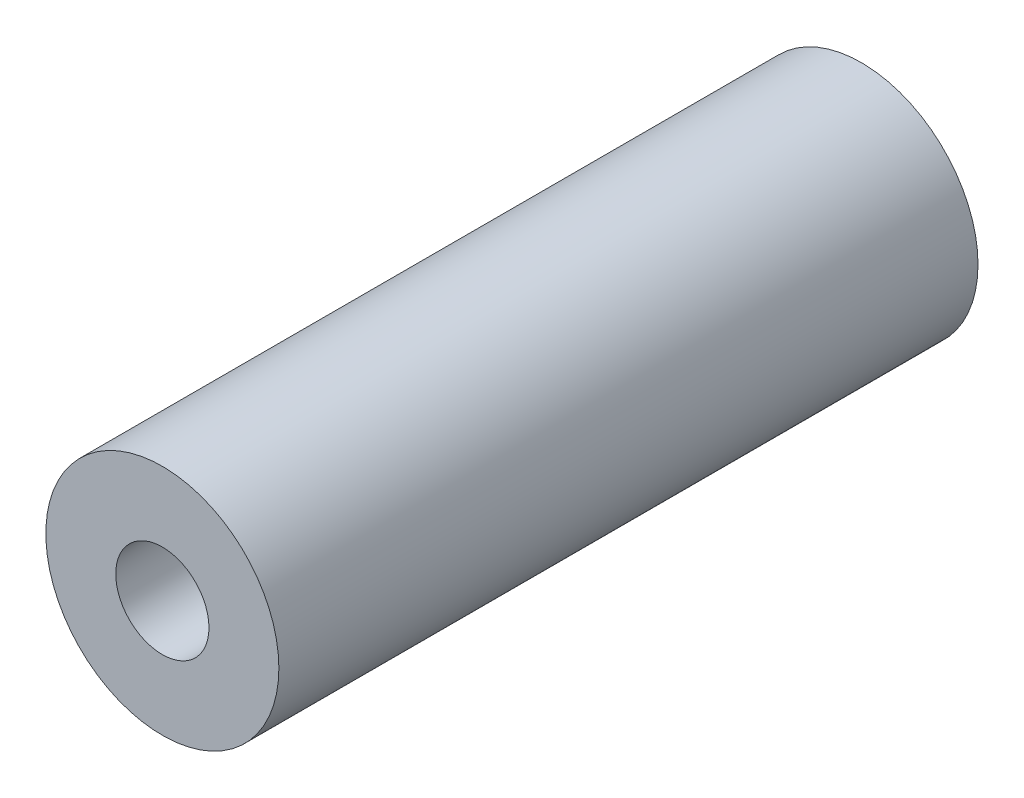
ISO-10303-21;
HEADER;
FILE_DESCRIPTION(('STEP AP214'),'2;1');
FILE_NAME('part.step','',(''),(''),'','','');
FILE_SCHEMA(('AUTOMOTIVE_DESIGN { 1 0 10303 214 1 1 1 1 }'));
ENDSEC;
DATA;
#1=APPLICATION_CONTEXT('core data for automotive mechanical design processes');
#2=APPLICATION_PROTOCOL_DEFINITION('international standard','automotive_design',2000,#1);
#3=PRODUCT_CONTEXT('',#1,'mechanical');
#4=PRODUCT('Part','Part','',(#3));
#5=PRODUCT_RELATED_PRODUCT_CATEGORY('part','',(#4));
#6=PRODUCT_DEFINITION_FORMATION('','',#4);
#7=PRODUCT_DEFINITION_CONTEXT('part definition',#1,'design');
#8=PRODUCT_DEFINITION('design','',#6,#7);
#9=PRODUCT_DEFINITION_SHAPE('','',#8);
#10=(LENGTH_UNIT() NAMED_UNIT(*) SI_UNIT(.MILLI.,.METRE.));
#11=(NAMED_UNIT(*) PLANE_ANGLE_UNIT() SI_UNIT($,.RADIAN.));
#12=(NAMED_UNIT(*) SI_UNIT($,.STERADIAN.) SOLID_ANGLE_UNIT());
#13=UNCERTAINTY_MEASURE_WITH_UNIT(LENGTH_MEASURE(1.E-05),#10,'distance_accuracy_value','');
#14=(GEOMETRIC_REPRESENTATION_CONTEXT(3) GLOBAL_UNCERTAINTY_ASSIGNED_CONTEXT((#13)) GLOBAL_UNIT_ASSIGNED_CONTEXT((#10,
#11,#12)) REPRESENTATION_CONTEXT('',''));
#15=CARTESIAN_POINT('',(0.,0.,0.));
#16=DIRECTION('',(0.,0.,1.));
#17=DIRECTION('',(1.,0.,0.));
#18=AXIS2_PLACEMENT_3D('',#15,#16,#17);
#19=CARTESIAN_POINT('',(0.,0.,24.));
#20=DIRECTION('',(0.,0.,1.));
#21=DIRECTION('',(1.,0.,0.));
#22=AXIS2_PLACEMENT_3D('',#19,#20,#21);
#23=PLANE('',#22);
#24=CARTESIAN_POINT('',(0.,0.,24.));
#25=DIRECTION('',(0.,0.,1.));
#26=DIRECTION('',(1.,0.,0.));
#27=AXIS2_PLACEMENT_3D('',#24,#25,#26);
#28=CIRCLE('',#27,4.);
#29=CARTESIAN_POINT('',(4.,0.,24.));
#30=VERTEX_POINT('',#29);
#31=EDGE_CURVE('E10',#30,#30,#28,.T.);
#32=ORIENTED_EDGE('',*,*,#31,.T.);
#33=EDGE_LOOP('',(#32));
#34=FACE_BOUND('',#33,.T.);
#35=CARTESIAN_POINT('',(0.,0.,24.));
#36=DIRECTION('',(0.,0.,1.));
#37=DIRECTION('',(1.,0.,0.));
#38=AXIS2_PLACEMENT_3D('',#35,#36,#37);
#39=CIRCLE('',#38,1.6);
#40=CARTESIAN_POINT('',(1.6,0.,24.));
#41=VERTEX_POINT('',#40);
#42=EDGE_CURVE('E55',#41,#41,#39,.T.);
#43=ORIENTED_EDGE('',*,*,#42,.F.);
#44=EDGE_LOOP('',(#43));
#45=FACE_BOUND('',#44,.T.);
#46=ADVANCED_FACE('F41',(#34,#45),#23,.T.);
#47=CARTESIAN_POINT('',(0.,0.,0.));
#48=DIRECTION('',(0.,0.,1.));
#49=DIRECTION('',(1.,0.,0.));
#50=AXIS2_PLACEMENT_3D('',#47,#48,#49);
#51=PLANE('',#50);
#52=CARTESIAN_POINT('',(0.,0.,0.));
#53=DIRECTION('',(0.,0.,1.));
#54=DIRECTION('',(1.,0.,0.));
#55=AXIS2_PLACEMENT_3D('',#52,#53,#54);
#56=CIRCLE('',#55,4.);
#57=CARTESIAN_POINT('',(4.,0.,0.));
#58=VERTEX_POINT('',#57);
#59=EDGE_CURVE('E44',#58,#58,#56,.T.);
#60=ORIENTED_EDGE('',*,*,#59,.F.);
#61=EDGE_LOOP('',(#60));
#62=FACE_BOUND('',#61,.T.);
#63=CARTESIAN_POINT('',(0.,0.,0.));
#64=DIRECTION('',(0.,0.,1.));
#65=DIRECTION('',(1.,0.,0.));
#66=AXIS2_PLACEMENT_3D('',#63,#64,#65);
#67=CIRCLE('',#66,1.6);
#68=CARTESIAN_POINT('',(1.6,0.,0.));
#69=VERTEX_POINT('',#68);
#70=EDGE_CURVE('E53',#69,#69,#67,.T.);
#71=ORIENTED_EDGE('',*,*,#70,.T.);
#72=EDGE_LOOP('',(#71));
#73=FACE_BOUND('',#72,.T.);
#74=ADVANCED_FACE('F63',(#62,#73),#51,.F.);
#75=CARTESIAN_POINT('',(0.,0.,24.));
#76=DIRECTION('',(0.,0.,-1.));
#77=DIRECTION('',(-1.,0.,0.));
#78=AXIS2_PLACEMENT_3D('',#75,#76,#77);
#79=CYLINDRICAL_SURFACE('',#78,4.);
#80=ORIENTED_EDGE('',*,*,#31,.F.);
#81=EDGE_LOOP('',(#80));
#82=FACE_BOUND('',#81,.T.);
#83=ORIENTED_EDGE('',*,*,#59,.T.);
#84=EDGE_LOOP('',(#83));
#85=FACE_BOUND('',#84,.T.);
#86=ADVANCED_FACE('F43',(#82,#85),#79,.T.);
#87=CARTESIAN_POINT('',(0.,0.,24.));
#88=DIRECTION('',(0.,0.,-1.));
#89=DIRECTION('',(-1.,0.,0.));
#90=AXIS2_PLACEMENT_3D('',#87,#88,#89);
#91=CYLINDRICAL_SURFACE('',#90,1.6);
#92=ORIENTED_EDGE('',*,*,#42,.T.);
#93=EDGE_LOOP('',(#92));
#94=FACE_BOUND('',#93,.T.);
#95=ORIENTED_EDGE('',*,*,#70,.F.);
#96=EDGE_LOOP('',(#95));
#97=FACE_BOUND('',#96,.T.);
#98=ADVANCED_FACE('F58',(#94,#97),#91,.F.);
#99=CLOSED_SHELL('',(#46,#74,#86,#98));
#100=MANIFOLD_SOLID_BREP('B2',#99);
#101=ADVANCED_BREP_SHAPE_REPRESENTATION('',(#18,#100),#14);
#102=SHAPE_DEFINITION_REPRESENTATION(#9,#101);
ENDSEC;
END-ISO-10303-21;
